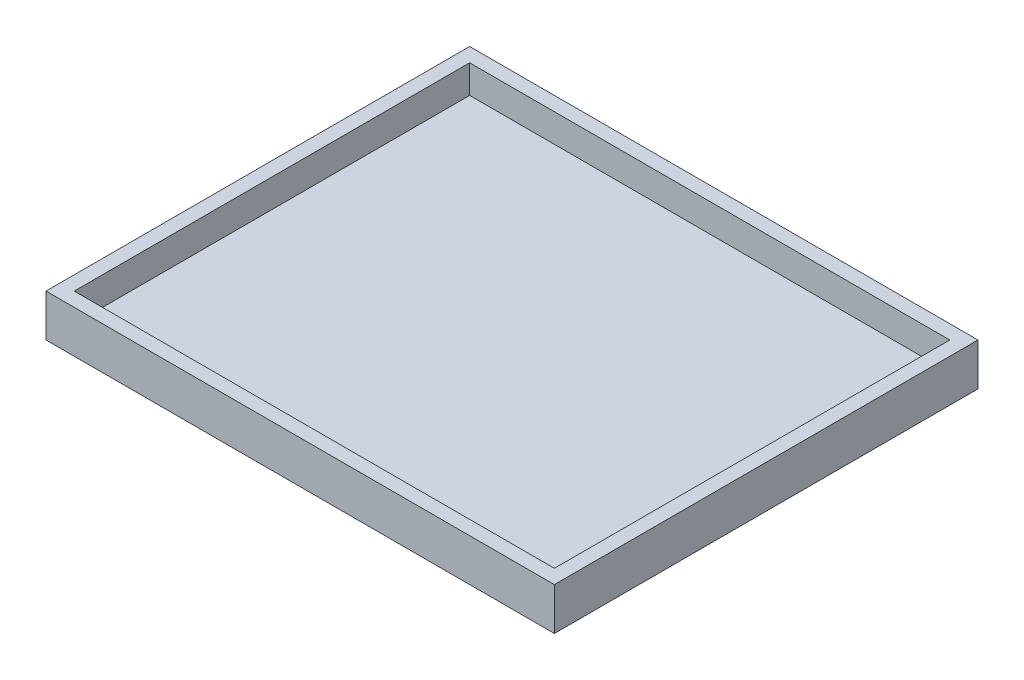
ISO-10303-21;
HEADER;
FILE_DESCRIPTION(('STEP AP214'),'2;1');
FILE_NAME('part.step','',(''),(''),'','','');
FILE_SCHEMA(('AUTOMOTIVE_DESIGN { 1 0 10303 214 1 1 1 1 }'));
ENDSEC;
DATA;
#1=APPLICATION_CONTEXT('core data for automotive mechanical design processes');
#2=APPLICATION_PROTOCOL_DEFINITION('international standard','automotive_design',2000,#1);
#3=PRODUCT_CONTEXT('',#1,'mechanical');
#4=PRODUCT('Part','Part','',(#3));
#5=PRODUCT_RELATED_PRODUCT_CATEGORY('part','',(#4));
#6=PRODUCT_DEFINITION_FORMATION('','',#4);
#7=PRODUCT_DEFINITION_CONTEXT('part definition',#1,'design');
#8=PRODUCT_DEFINITION('design','',#6,#7);
#9=PRODUCT_DEFINITION_SHAPE('','',#8);
#10=(LENGTH_UNIT() NAMED_UNIT(*) SI_UNIT(.MILLI.,.METRE.));
#11=(NAMED_UNIT(*) PLANE_ANGLE_UNIT() SI_UNIT($,.RADIAN.));
#12=(NAMED_UNIT(*) SI_UNIT($,.STERADIAN.) SOLID_ANGLE_UNIT());
#13=UNCERTAINTY_MEASURE_WITH_UNIT(LENGTH_MEASURE(1.E-05),#10,'distance_accuracy_value','');
#14=(GEOMETRIC_REPRESENTATION_CONTEXT(3) GLOBAL_UNCERTAINTY_ASSIGNED_CONTEXT((#13)) GLOBAL_UNIT_ASSIGNED_CONTEXT((#10,
#11,#12)) REPRESENTATION_CONTEXT('',''));
#15=CARTESIAN_POINT('',(0.,0.,0.));
#16=DIRECTION('',(0.,0.,1.));
#17=DIRECTION('',(1.,0.,0.));
#18=AXIS2_PLACEMENT_3D('',#15,#16,#17);
#19=CARTESIAN_POINT('',(-45.081589688507,7.62,-7.09617615467239));
#20=DIRECTION('',(1.,0.,0.));
#21=DIRECTION('',(0.,0.,-1.));
#22=AXIS2_PLACEMENT_3D('',#19,#20,#21);
#23=PLANE('',#22);
#24=DIRECTION('',(0.,0.,1.));
#25=VECTOR('',#24,1.);
#26=CARTESIAN_POINT('',(-45.081589688507,0.,-7.09617615467239));
#27=LINE('',#26,#25);
#28=CARTESIAN_POINT('',(-45.081589688507,0.,-7.09617615467239));
#29=VERTEX_POINT('',#28);
#30=CARTESIAN_POINT('',(-45.081589688507,0.,69.1038238453276));
#31=VERTEX_POINT('',#30);
#32=EDGE_CURVE('E140',#29,#31,#27,.T.);
#33=ORIENTED_EDGE('',*,*,#32,.T.);
#34=DIRECTION('',(0.,-1.,0.));
#35=VECTOR('',#34,1.);
#36=CARTESIAN_POINT('',(-45.081589688507,7.62,69.1038238453276));
#37=LINE('',#36,#35);
#38=CARTESIAN_POINT('',(-45.081589688507,7.62,69.1038238453276));
#39=VERTEX_POINT('',#38);
#40=EDGE_CURVE('E11',#39,#31,#37,.T.);
#41=ORIENTED_EDGE('',*,*,#40,.F.);
#42=DIRECTION('',(0.,0.,1.));
#43=VECTOR('',#42,1.);
#44=CARTESIAN_POINT('',(-45.081589688507,7.62,-7.09617615467239));
#45=LINE('',#44,#43);
#46=CARTESIAN_POINT('',(-45.081589688507,7.62,-7.09617615467239));
#47=VERTEX_POINT('',#46);
#48=EDGE_CURVE('E144',#47,#39,#45,.T.);
#49=ORIENTED_EDGE('',*,*,#48,.F.);
#50=DIRECTION('',(0.,-1.,0.));
#51=VECTOR('',#50,1.);
#52=CARTESIAN_POINT('',(-45.081589688507,7.62,-7.09617615467239));
#53=LINE('',#52,#51);
#54=EDGE_CURVE('E150',#47,#29,#53,.T.);
#55=ORIENTED_EDGE('',*,*,#54,.T.);
#56=EDGE_LOOP('',(#33,#41,#49,#55));
#57=FACE_BOUND('',#56,.T.);
#58=ADVANCED_FACE('F32',(#57),#23,.F.);
#59=CARTESIAN_POINT('',(-45.081589688507,7.62,69.1038238453276));
#60=DIRECTION('',(0.,0.,-1.));
#61=DIRECTION('',(-1.,0.,0.));
#62=AXIS2_PLACEMENT_3D('',#59,#60,#61);
#63=PLANE('',#62);
#64=DIRECTION('',(1.,0.,0.));
#65=VECTOR('',#64,1.);
#66=CARTESIAN_POINT('',(-45.081589688507,0.,69.1038238453276));
#67=LINE('',#66,#65);
#68=CARTESIAN_POINT('',(46.358410311493,0.,69.1038238453276));
#69=VERTEX_POINT('',#68);
#70=EDGE_CURVE('E153',#31,#69,#67,.T.);
#71=ORIENTED_EDGE('',*,*,#70,.T.);
#72=DIRECTION('',(0.,-1.,0.));
#73=VECTOR('',#72,1.);
#74=CARTESIAN_POINT('',(46.358410311493,7.62,69.1038238453276));
#75=LINE('',#74,#73);
#76=CARTESIAN_POINT('',(46.358410311493,7.62,69.1038238453276));
#77=VERTEX_POINT('',#76);
#78=EDGE_CURVE('E39',#77,#69,#75,.T.);
#79=ORIENTED_EDGE('',*,*,#78,.F.);
#80=DIRECTION('',(1.,0.,0.));
#81=VECTOR('',#80,1.);
#82=CARTESIAN_POINT('',(-45.081589688507,7.62,69.1038238453276));
#83=LINE('',#82,#81);
#84=EDGE_CURVE('E83',#39,#77,#83,.T.);
#85=ORIENTED_EDGE('',*,*,#84,.F.);
#86=ORIENTED_EDGE('',*,*,#40,.T.);
#87=EDGE_LOOP('',(#71,#79,#85,#86));
#88=FACE_BOUND('',#87,.T.);
#89=ADVANCED_FACE('F182',(#88),#63,.F.);
#90=CARTESIAN_POINT('',(46.358410311493,7.62,-7.09617615467239));
#91=DIRECTION('',(-1.,0.,0.));
#92=DIRECTION('',(0.,0.,1.));
#93=AXIS2_PLACEMENT_3D('',#90,#91,#92);
#94=PLANE('',#93);
#95=DIRECTION('',(0.,0.,-1.));
#96=VECTOR('',#95,1.);
#97=CARTESIAN_POINT('',(46.358410311493,0.,-7.09617615467239));
#98=LINE('',#97,#96);
#99=CARTESIAN_POINT('',(46.358410311493,0.,-7.09617615467239));
#100=VERTEX_POINT('',#99);
#101=EDGE_CURVE('E155',#69,#100,#98,.T.);
#102=ORIENTED_EDGE('',*,*,#101,.T.);
#103=DIRECTION('',(0.,-1.,0.));
#104=VECTOR('',#103,1.);
#105=CARTESIAN_POINT('',(46.358410311493,7.62,-7.09617615467239));
#106=LINE('',#105,#104);
#107=CARTESIAN_POINT('',(46.358410311493,7.62,-7.09617615467239));
#108=VERTEX_POINT('',#107);
#109=EDGE_CURVE('E159',#108,#100,#106,.T.);
#110=ORIENTED_EDGE('',*,*,#109,.F.);
#111=DIRECTION('',(0.,0.,-1.));
#112=VECTOR('',#111,1.);
#113=CARTESIAN_POINT('',(46.358410311493,7.62,-7.09617615467239));
#114=LINE('',#113,#112);
#115=EDGE_CURVE('E147',#77,#108,#114,.T.);
#116=ORIENTED_EDGE('',*,*,#115,.F.);
#117=ORIENTED_EDGE('',*,*,#78,.T.);
#118=EDGE_LOOP('',(#102,#110,#116,#117));
#119=FACE_BOUND('',#118,.T.);
#120=ADVANCED_FACE('F164',(#119),#94,.F.);
#121=CARTESIAN_POINT('',(-45.081589688507,7.62,-7.09617615467239));
#122=DIRECTION('',(0.,0.,1.));
#123=DIRECTION('',(1.,0.,0.));
#124=AXIS2_PLACEMENT_3D('',#121,#122,#123);
#125=PLANE('',#124);
#126=DIRECTION('',(-1.,0.,0.));
#127=VECTOR('',#126,1.);
#128=CARTESIAN_POINT('',(-45.081589688507,0.,-7.09617615467239));
#129=LINE('',#128,#127);
#130=EDGE_CURVE('E76',#100,#29,#129,.T.);
#131=ORIENTED_EDGE('',*,*,#130,.T.);
#132=ORIENTED_EDGE('',*,*,#54,.F.);
#133=DIRECTION('',(-1.,0.,0.));
#134=VECTOR('',#133,1.);
#135=CARTESIAN_POINT('',(-45.081589688507,7.62,-7.09617615467239));
#136=LINE('',#135,#134);
#137=EDGE_CURVE('E55',#108,#47,#136,.T.);
#138=ORIENTED_EDGE('',*,*,#137,.F.);
#139=ORIENTED_EDGE('',*,*,#109,.T.);
#140=EDGE_LOOP('',(#131,#132,#138,#139));
#141=FACE_BOUND('',#140,.T.);
#142=ADVANCED_FACE('F172',(#141),#125,.F.);
#143=CARTESIAN_POINT('',(0.,7.62,0.));
#144=DIRECTION('',(0.,1.,0.));
#145=DIRECTION('',(0.,0.,1.));
#146=AXIS2_PLACEMENT_3D('',#143,#144,#145);
#147=PLANE('',#146);
#148=DIRECTION('',(0.,0.,1.));
#149=VECTOR('',#148,1.);
#150=CARTESIAN_POINT('',(-42.541589688507,7.62,-4.55617615467239));
#151=LINE('',#150,#149);
#152=CARTESIAN_POINT('',(-42.541589688507,7.62,-4.55617615467239));
#153=VERTEX_POINT('',#152);
#154=CARTESIAN_POINT('',(-42.541589688507,7.62,66.5638238453276));
#155=VERTEX_POINT('',#154);
#156=EDGE_CURVE('E46',#153,#155,#151,.T.);
#157=ORIENTED_EDGE('',*,*,#156,.F.);
#158=DIRECTION('',(-1.,0.,0.));
#159=VECTOR('',#158,1.);
#160=CARTESIAN_POINT('',(-42.541589688507,7.62,-4.55617615467239));
#161=LINE('',#160,#159);
#162=CARTESIAN_POINT('',(43.818410311493,7.62,-4.55617615467239));
#163=VERTEX_POINT('',#162);
#164=EDGE_CURVE('E125',#163,#153,#161,.T.);
#165=ORIENTED_EDGE('',*,*,#164,.F.);
#166=DIRECTION('',(0.,0.,-1.));
#167=VECTOR('',#166,1.);
#168=CARTESIAN_POINT('',(43.818410311493,7.62,-4.55617615467239));
#169=LINE('',#168,#167);
#170=CARTESIAN_POINT('',(43.818410311493,7.62,66.5638238453276));
#171=VERTEX_POINT('',#170);
#172=EDGE_CURVE('E128',#171,#163,#169,.T.);
#173=ORIENTED_EDGE('',*,*,#172,.F.);
#174=DIRECTION('',(1.,0.,0.));
#175=VECTOR('',#174,1.);
#176=CARTESIAN_POINT('',(-42.541589688507,7.62,66.5638238453276));
#177=LINE('',#176,#175);
#178=EDGE_CURVE('E134',#155,#171,#177,.T.);
#179=ORIENTED_EDGE('',*,*,#178,.F.);
#180=EDGE_LOOP('',(#157,#165,#173,#179));
#181=FACE_BOUND('',#180,.T.);
#182=ORIENTED_EDGE('',*,*,#48,.T.);
#183=ORIENTED_EDGE('',*,*,#84,.T.);
#184=ORIENTED_EDGE('',*,*,#115,.T.);
#185=ORIENTED_EDGE('',*,*,#137,.T.);
#186=EDGE_LOOP('',(#182,#183,#184,#185));
#187=FACE_BOUND('',#186,.T.);
#188=ADVANCED_FACE('F174',(#181,#187),#147,.T.);
#189=CARTESIAN_POINT('',(0.,0.,0.));
#190=DIRECTION('',(0.,1.,0.));
#191=DIRECTION('',(0.,0.,1.));
#192=AXIS2_PLACEMENT_3D('',#189,#190,#191);
#193=PLANE('',#192);
#194=ORIENTED_EDGE('',*,*,#32,.F.);
#195=ORIENTED_EDGE('',*,*,#130,.F.);
#196=ORIENTED_EDGE('',*,*,#101,.F.);
#197=ORIENTED_EDGE('',*,*,#70,.F.);
#198=EDGE_LOOP('',(#194,#195,#196,#197));
#199=FACE_BOUND('',#198,.T.);
#200=ADVANCED_FACE('F168',(#199),#193,.F.);
#201=CARTESIAN_POINT('',(-42.541589688507,2.54,-4.55617615467239));
#202=DIRECTION('',(-1.,0.,0.));
#203=DIRECTION('',(0.,0.,1.));
#204=AXIS2_PLACEMENT_3D('',#201,#202,#203);
#205=PLANE('',#204);
#206=ORIENTED_EDGE('',*,*,#156,.T.);
#207=DIRECTION('',(0.,1.,0.));
#208=VECTOR('',#207,1.);
#209=CARTESIAN_POINT('',(-42.541589688507,2.54,66.5638238453276));
#210=LINE('',#209,#208);
#211=CARTESIAN_POINT('',(-42.541589688507,2.54,66.5638238453276));
#212=VERTEX_POINT('',#211);
#213=EDGE_CURVE('E103',#212,#155,#210,.T.);
#214=ORIENTED_EDGE('',*,*,#213,.F.);
#215=DIRECTION('',(0.,0.,1.));
#216=VECTOR('',#215,1.);
#217=CARTESIAN_POINT('',(-42.541589688507,2.54,-4.55617615467239));
#218=LINE('',#217,#216);
#219=CARTESIAN_POINT('',(-42.541589688507,2.54,-4.55617615467239));
#220=VERTEX_POINT('',#219);
#221=EDGE_CURVE('E107',#220,#212,#218,.T.);
#222=ORIENTED_EDGE('',*,*,#221,.F.);
#223=DIRECTION('',(0.,1.,0.));
#224=VECTOR('',#223,1.);
#225=CARTESIAN_POINT('',(-42.541589688507,2.54,-4.55617615467239));
#226=LINE('',#225,#224);
#227=EDGE_CURVE('E138',#220,#153,#226,.T.);
#228=ORIENTED_EDGE('',*,*,#227,.T.);
#229=EDGE_LOOP('',(#206,#214,#222,#228));
#230=FACE_BOUND('',#229,.T.);
#231=ADVANCED_FACE('F105',(#230),#205,.F.);
#232=CARTESIAN_POINT('',(-42.541589688507,2.54,-4.55617615467239));
#233=DIRECTION('',(0.,0.,-1.));
#234=DIRECTION('',(-1.,0.,0.));
#235=AXIS2_PLACEMENT_3D('',#232,#233,#234);
#236=PLANE('',#235);
#237=ORIENTED_EDGE('',*,*,#164,.T.);
#238=ORIENTED_EDGE('',*,*,#227,.F.);
#239=DIRECTION('',(-1.,0.,0.));
#240=VECTOR('',#239,1.);
#241=CARTESIAN_POINT('',(-42.541589688507,2.54,-4.55617615467239));
#242=LINE('',#241,#240);
#243=CARTESIAN_POINT('',(43.818410311493,2.54,-4.55617615467239));
#244=VERTEX_POINT('',#243);
#245=EDGE_CURVE('E113',#244,#220,#242,.T.);
#246=ORIENTED_EDGE('',*,*,#245,.F.);
#247=DIRECTION('',(0.,1.,0.));
#248=VECTOR('',#247,1.);
#249=CARTESIAN_POINT('',(43.818410311493,2.54,-4.55617615467239));
#250=LINE('',#249,#248);
#251=EDGE_CURVE('E141',#244,#163,#250,.T.);
#252=ORIENTED_EDGE('',*,*,#251,.T.);
#253=EDGE_LOOP('',(#237,#238,#246,#252));
#254=FACE_BOUND('',#253,.T.);
#255=ADVANCED_FACE('F221',(#254),#236,.F.);
#256=CARTESIAN_POINT('',(43.818410311493,2.54,-4.55617615467239));
#257=DIRECTION('',(1.,0.,0.));
#258=DIRECTION('',(0.,0.,-1.));
#259=AXIS2_PLACEMENT_3D('',#256,#257,#258);
#260=PLANE('',#259);
#261=ORIENTED_EDGE('',*,*,#172,.T.);
#262=ORIENTED_EDGE('',*,*,#251,.F.);
#263=DIRECTION('',(0.,0.,-1.));
#264=VECTOR('',#263,1.);
#265=CARTESIAN_POINT('',(43.818410311493,2.54,-4.55617615467239));
#266=LINE('',#265,#264);
#267=CARTESIAN_POINT('',(43.818410311493,2.54,66.5638238453276));
#268=VERTEX_POINT('',#267);
#269=EDGE_CURVE('E121',#268,#244,#266,.T.);
#270=ORIENTED_EDGE('',*,*,#269,.F.);
#271=DIRECTION('',(0.,1.,0.));
#272=VECTOR('',#271,1.);
#273=CARTESIAN_POINT('',(43.818410311493,2.54,66.5638238453276));
#274=LINE('',#273,#272);
#275=EDGE_CURVE('E112',#268,#171,#274,.T.);
#276=ORIENTED_EDGE('',*,*,#275,.T.);
#277=EDGE_LOOP('',(#261,#262,#270,#276));
#278=FACE_BOUND('',#277,.T.);
#279=ADVANCED_FACE('F230',(#278),#260,.F.);
#280=CARTESIAN_POINT('',(-42.541589688507,2.54,66.5638238453276));
#281=DIRECTION('',(0.,0.,1.));
#282=DIRECTION('',(1.,0.,0.));
#283=AXIS2_PLACEMENT_3D('',#280,#281,#282);
#284=PLANE('',#283);
#285=ORIENTED_EDGE('',*,*,#178,.T.);
#286=ORIENTED_EDGE('',*,*,#275,.F.);
#287=DIRECTION('',(1.,0.,0.));
#288=VECTOR('',#287,1.);
#289=CARTESIAN_POINT('',(-42.541589688507,2.54,66.5638238453276));
#290=LINE('',#289,#288);
#291=EDGE_CURVE('E116',#212,#268,#290,.T.);
#292=ORIENTED_EDGE('',*,*,#291,.F.);
#293=ORIENTED_EDGE('',*,*,#213,.T.);
#294=EDGE_LOOP('',(#285,#286,#292,#293));
#295=FACE_BOUND('',#294,.T.);
#296=ADVANCED_FACE('F117',(#295),#284,.F.);
#297=CARTESIAN_POINT('',(0.,2.54,0.));
#298=DIRECTION('',(0.,1.,0.));
#299=DIRECTION('',(0.,0.,1.));
#300=AXIS2_PLACEMENT_3D('',#297,#298,#299);
#301=PLANE('',#300);
#302=ORIENTED_EDGE('',*,*,#221,.T.);
#303=ORIENTED_EDGE('',*,*,#291,.T.);
#304=ORIENTED_EDGE('',*,*,#269,.T.);
#305=ORIENTED_EDGE('',*,*,#245,.T.);
#306=EDGE_LOOP('',(#302,#303,#304,#305));
#307=FACE_BOUND('',#306,.T.);
#308=ADVANCED_FACE('F123',(#307),#301,.T.);
#309=CLOSED_SHELL('',(#58,#89,#120,#142,#188,#200,#231,#255,#279,#296,#308));
#310=MANIFOLD_SOLID_BREP('B2',#309);
#311=ADVANCED_BREP_SHAPE_REPRESENTATION('',(#18,#310),#14);
#312=SHAPE_DEFINITION_REPRESENTATION(#9,#311);
ENDSEC;
END-ISO-10303-21;
